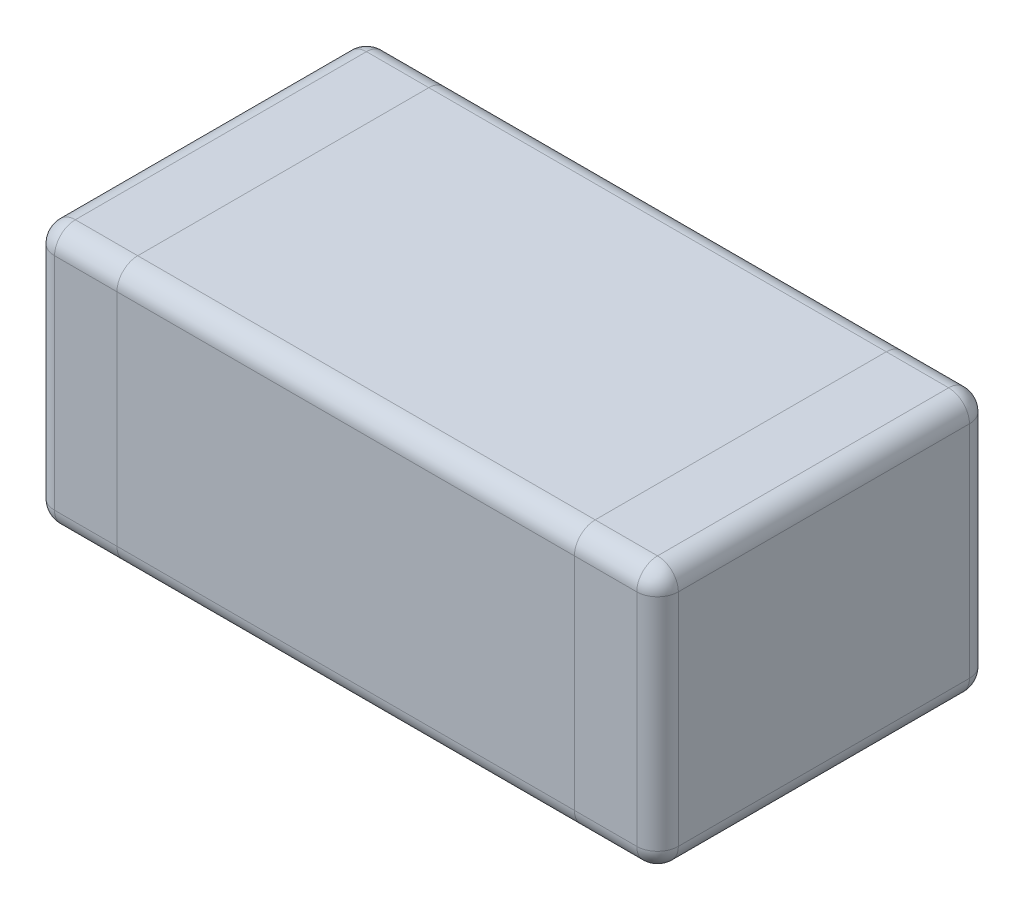
ISO-10303-21;
HEADER;
FILE_DESCRIPTION(('STEP AP214'),'2;1');
FILE_NAME('part.step','',(''),(''),'','','');
FILE_SCHEMA(('AUTOMOTIVE_DESIGN { 1 0 10303 214 1 1 1 1 }'));
ENDSEC;
DATA;
#1=APPLICATION_CONTEXT('core data for automotive mechanical design processes');
#2=APPLICATION_PROTOCOL_DEFINITION('international standard','automotive_design',2000,#1);
#3=PRODUCT_CONTEXT('',#1,'mechanical');
#4=PRODUCT('Part','Part','',(#3));
#5=PRODUCT_RELATED_PRODUCT_CATEGORY('part','',(#4));
#6=PRODUCT_DEFINITION_FORMATION('','',#4);
#7=PRODUCT_DEFINITION_CONTEXT('part definition',#1,'design');
#8=PRODUCT_DEFINITION('design','',#6,#7);
#9=PRODUCT_DEFINITION_SHAPE('','',#8);
#10=(LENGTH_UNIT() NAMED_UNIT(*) SI_UNIT(.MILLI.,.METRE.));
#11=(NAMED_UNIT(*) PLANE_ANGLE_UNIT() SI_UNIT($,.RADIAN.));
#12=(NAMED_UNIT(*) SI_UNIT($,.STERADIAN.) SOLID_ANGLE_UNIT());
#13=UNCERTAINTY_MEASURE_WITH_UNIT(LENGTH_MEASURE(1.E-05),#10,'distance_accuracy_value','');
#14=(GEOMETRIC_REPRESENTATION_CONTEXT(3) GLOBAL_UNCERTAINTY_ASSIGNED_CONTEXT((#13)) GLOBAL_UNIT_ASSIGNED_CONTEXT((#10,
#11,#12)) REPRESENTATION_CONTEXT('',''));
#15=CARTESIAN_POINT('',(0.,0.,0.));
#16=DIRECTION('',(0.,0.,1.));
#17=DIRECTION('',(1.,0.,0.));
#18=AXIS2_PLACEMENT_3D('',#15,#16,#17);
#19=CARTESIAN_POINT('',(0.7,0.63,-0.35));
#20=DIRECTION('',(0.,-1.,0.));
#21=DIRECTION('',(0.,0.,-1.));
#22=AXIS2_PLACEMENT_3D('',#19,#20,#21);
#23=CYLINDRICAL_SURFACE('',#22,0.05);
#24=CARTESIAN_POINT('',(0.7,0.58,-0.35));
#25=DIRECTION('',(0.,-1.,0.));
#26=DIRECTION('',(0.,0.,1.));
#27=AXIS2_PLACEMENT_3D('',#24,#25,#26);
#28=CIRCLE('',#27,0.05);
#29=CARTESIAN_POINT('',(0.7,0.58,-0.4));
#30=VERTEX_POINT('',#29);
#31=CARTESIAN_POINT('',(0.75,0.58,-0.35));
#32=VERTEX_POINT('',#31);
#33=EDGE_CURVE('E27',#30,#32,#28,.T.);
#34=ORIENTED_EDGE('',*,*,#33,.T.);
#35=DIRECTION('',(0.,1.,0.));
#36=VECTOR('',#35,1.);
#37=CARTESIAN_POINT('',(0.75,0.63,-0.35));
#38=LINE('',#37,#36);
#39=CARTESIAN_POINT('',(0.75,0.05,-0.35));
#40=VERTEX_POINT('',#39);
#41=EDGE_CURVE('E314',#40,#32,#38,.T.);
#42=ORIENTED_EDGE('',*,*,#41,.F.);
#43=CARTESIAN_POINT('',(0.7,0.05,-0.35));
#44=DIRECTION('',(0.,1.,0.));
#45=DIRECTION('',(0.,0.,-1.));
#46=AXIS2_PLACEMENT_3D('',#43,#44,#45);
#47=CIRCLE('',#46,0.05);
#48=CARTESIAN_POINT('',(0.7,0.05,-0.4));
#49=VERTEX_POINT('',#48);
#50=EDGE_CURVE('E11',#40,#49,#47,.T.);
#51=ORIENTED_EDGE('',*,*,#50,.T.);
#52=DIRECTION('',(0.,-1.,0.));
#53=VECTOR('',#52,1.);
#54=CARTESIAN_POINT('',(0.7,0.63,-0.4));
#55=LINE('',#54,#53);
#56=EDGE_CURVE('E230',#30,#49,#55,.T.);
#57=ORIENTED_EDGE('',*,*,#56,.F.);
#58=EDGE_LOOP('',(#34,#42,#51,#57));
#59=FACE_BOUND('',#58,.T.);
#60=ADVANCED_FACE('F16',(#59),#23,.T.);
#61=CARTESIAN_POINT('',(0.7,0.05,-0.35));
#62=DIRECTION('',(0.,1.,0.));
#63=DIRECTION('',(1.,0.,0.));
#64=AXIS2_PLACEMENT_3D('',#61,#62,#63);
#65=SPHERICAL_SURFACE('',#64,0.05);
#66=CARTESIAN_POINT('',(0.7,0.05,-0.35));
#67=DIRECTION('',(0.,0.,-1.));
#68=DIRECTION('',(-1.,0.,0.));
#69=AXIS2_PLACEMENT_3D('',#66,#67,#68);
#70=CIRCLE('',#69,0.05);
#71=CARTESIAN_POINT('',(0.7,0.,-0.35));
#72=VERTEX_POINT('',#71);
#73=EDGE_CURVE('E391',#40,#72,#70,.T.);
#74=ORIENTED_EDGE('',*,*,#73,.T.);
#75=CARTESIAN_POINT('',(0.7,0.05,-0.35));
#76=DIRECTION('',(1.,0.,0.));
#77=DIRECTION('',(0.,0.,-1.));
#78=AXIS2_PLACEMENT_3D('',#75,#76,#77);
#79=CIRCLE('',#78,0.05);
#80=EDGE_CURVE('E353',#72,#49,#79,.T.);
#81=ORIENTED_EDGE('',*,*,#80,.T.);
#82=ORIENTED_EDGE('',*,*,#50,.F.);
#83=EDGE_LOOP('',(#74,#81,#82));
#84=FACE_BOUND('',#83,.T.);
#85=ADVANCED_FACE('F553',(#84),#65,.T.);
#86=CARTESIAN_POINT('',(0.7,0.58,-0.35));
#87=DIRECTION('',(0.,1.,0.));
#88=DIRECTION('',(1.,0.,0.));
#89=AXIS2_PLACEMENT_3D('',#86,#87,#88);
#90=SPHERICAL_SURFACE('',#89,0.05);
#91=CARTESIAN_POINT('',(0.7,0.58,-0.35));
#92=DIRECTION('',(1.,0.,0.));
#93=DIRECTION('',(0.,1.,0.));
#94=AXIS2_PLACEMENT_3D('',#91,#92,#93);
#95=CIRCLE('',#94,0.05);
#96=CARTESIAN_POINT('',(0.7,0.63,-0.35));
#97=VERTEX_POINT('',#96);
#98=EDGE_CURVE('E239',#30,#97,#95,.T.);
#99=ORIENTED_EDGE('',*,*,#98,.T.);
#100=CARTESIAN_POINT('',(0.7,0.58,-0.35));
#101=DIRECTION('',(0.,0.,-1.));
#102=DIRECTION('',(-1.,0.,0.));
#103=AXIS2_PLACEMENT_3D('',#100,#101,#102);
#104=CIRCLE('',#103,0.05);
#105=EDGE_CURVE('E465',#97,#32,#104,.T.);
#106=ORIENTED_EDGE('',*,*,#105,.T.);
#107=ORIENTED_EDGE('',*,*,#33,.F.);
#108=EDGE_LOOP('',(#99,#106,#107));
#109=FACE_BOUND('',#108,.T.);
#110=ADVANCED_FACE('F559',(#109),#90,.T.);
#111=CARTESIAN_POINT('',(0.7,0.05,0.4));
#112=DIRECTION('',(0.,0.,1.));
#113=DIRECTION('',(1.,0.,0.));
#114=AXIS2_PLACEMENT_3D('',#111,#112,#113);
#115=CYLINDRICAL_SURFACE('',#114,0.05);
#116=CARTESIAN_POINT('',(0.7,0.05,0.35));
#117=DIRECTION('',(0.,0.,-1.));
#118=DIRECTION('',(1.,0.,0.));
#119=AXIS2_PLACEMENT_3D('',#116,#117,#118);
#120=CIRCLE('',#119,0.05);
#121=CARTESIAN_POINT('',(0.75,0.05,0.35));
#122=VERTEX_POINT('',#121);
#123=CARTESIAN_POINT('',(0.7,0.,0.35));
#124=VERTEX_POINT('',#123);
#125=EDGE_CURVE('E311',#122,#124,#120,.T.);
#126=ORIENTED_EDGE('',*,*,#125,.T.);
#127=DIRECTION('',(0.,0.,1.));
#128=VECTOR('',#127,1.);
#129=CARTESIAN_POINT('',(0.7,0.,0.4));
#130=LINE('',#129,#128);
#131=EDGE_CURVE('E275',#72,#124,#130,.T.);
#132=ORIENTED_EDGE('',*,*,#131,.F.);
#133=ORIENTED_EDGE('',*,*,#73,.F.);
#134=DIRECTION('',(0.,0.,-1.));
#135=VECTOR('',#134,1.);
#136=CARTESIAN_POINT('',(0.75,0.05,-0.4));
#137=LINE('',#136,#135);
#138=EDGE_CURVE('E307',#122,#40,#137,.T.);
#139=ORIENTED_EDGE('',*,*,#138,.F.);
#140=EDGE_LOOP('',(#126,#132,#133,#139));
#141=FACE_BOUND('',#140,.T.);
#142=ADVANCED_FACE('F695',(#141),#115,.T.);
#143=CARTESIAN_POINT('',(-0.75,0.05,-0.35));
#144=DIRECTION('',(1.,0.,0.));
#145=DIRECTION('',(0.,0.,-1.));
#146=AXIS2_PLACEMENT_3D('',#143,#144,#145);
#147=CYLINDRICAL_SURFACE('',#146,0.05);
#148=CARTESIAN_POINT('',(-0.55,0.05,-0.35));
#149=DIRECTION('',(-1.,0.,0.));
#150=DIRECTION('',(0.,0.,-1.));
#151=AXIS2_PLACEMENT_3D('',#148,#149,#150);
#152=CIRCLE('',#151,0.05);
#153=CARTESIAN_POINT('',(-0.55,0.05,-0.4));
#154=VERTEX_POINT('',#153);
#155=CARTESIAN_POINT('',(-0.55,0.,-0.35));
#156=VERTEX_POINT('',#155);
#157=EDGE_CURVE('E265',#154,#156,#152,.T.);
#158=ORIENTED_EDGE('',*,*,#157,.F.);
#159=DIRECTION('',(-1.,0.,0.));
#160=VECTOR('',#159,1.);
#161=CARTESIAN_POINT('',(-0.75,0.05,-0.4));
#162=LINE('',#161,#160);
#163=CARTESIAN_POINT('',(0.55,0.05,-0.4));
#164=VERTEX_POINT('',#163);
#165=EDGE_CURVE('E218',#164,#154,#162,.T.);
#166=ORIENTED_EDGE('',*,*,#165,.F.);
#167=CARTESIAN_POINT('',(0.55,0.05,-0.35));
#168=DIRECTION('',(1.,0.,0.));
#169=DIRECTION('',(0.,0.,1.));
#170=AXIS2_PLACEMENT_3D('',#167,#168,#169);
#171=CIRCLE('',#170,0.05);
#172=CARTESIAN_POINT('',(0.55,0.,-0.35));
#173=VERTEX_POINT('',#172);
#174=EDGE_CURVE('E354',#173,#164,#171,.T.);
#175=ORIENTED_EDGE('',*,*,#174,.F.);
#176=DIRECTION('',(1.,0.,0.));
#177=VECTOR('',#176,1.);
#178=CARTESIAN_POINT('',(0.75,0.,-0.35));
#179=LINE('',#178,#177);
#180=EDGE_CURVE('E388',#156,#173,#179,.T.);
#181=ORIENTED_EDGE('',*,*,#180,.F.);
#182=EDGE_LOOP('',(#158,#166,#175,#181));
#183=FACE_BOUND('',#182,.T.);
#184=ADVANCED_FACE('F532',(#183),#147,.T.);
#185=CARTESIAN_POINT('',(0.75,0.58,-0.35));
#186=DIRECTION('',(-1.,0.,0.));
#187=DIRECTION('',(0.,0.,1.));
#188=AXIS2_PLACEMENT_3D('',#185,#186,#187);
#189=CYLINDRICAL_SURFACE('',#188,0.05);
#190=CARTESIAN_POINT('',(-0.55,0.58,-0.35));
#191=DIRECTION('',(-1.,0.,0.));
#192=DIRECTION('',(0.,0.,-1.));
#193=AXIS2_PLACEMENT_3D('',#190,#191,#192);
#194=CIRCLE('',#193,0.05);
#195=CARTESIAN_POINT('',(-0.55,0.63,-0.35));
#196=VERTEX_POINT('',#195);
#197=CARTESIAN_POINT('',(-0.55,0.58,-0.4));
#198=VERTEX_POINT('',#197);
#199=EDGE_CURVE('E271',#196,#198,#194,.T.);
#200=ORIENTED_EDGE('',*,*,#199,.F.);
#201=DIRECTION('',(-1.,0.,0.));
#202=VECTOR('',#201,1.);
#203=CARTESIAN_POINT('',(0.75,0.63,-0.35));
#204=LINE('',#203,#202);
#205=CARTESIAN_POINT('',(0.55,0.63,-0.35));
#206=VERTEX_POINT('',#205);
#207=EDGE_CURVE('E97',#206,#196,#204,.T.);
#208=ORIENTED_EDGE('',*,*,#207,.F.);
#209=CARTESIAN_POINT('',(0.55,0.58,-0.35));
#210=DIRECTION('',(1.,0.,0.));
#211=DIRECTION('',(0.,0.,1.));
#212=AXIS2_PLACEMENT_3D('',#209,#210,#211);
#213=CIRCLE('',#212,0.05);
#214=CARTESIAN_POINT('',(0.55,0.58,-0.4));
#215=VERTEX_POINT('',#214);
#216=EDGE_CURVE('E233',#215,#206,#213,.T.);
#217=ORIENTED_EDGE('',*,*,#216,.F.);
#218=DIRECTION('',(1.,0.,0.));
#219=VECTOR('',#218,1.);
#220=CARTESIAN_POINT('',(-0.75,0.58,-0.4));
#221=LINE('',#220,#219);
#222=EDGE_CURVE('E208',#198,#215,#221,.T.);
#223=ORIENTED_EDGE('',*,*,#222,.F.);
#224=EDGE_LOOP('',(#200,#208,#217,#223));
#225=FACE_BOUND('',#224,.T.);
#226=ADVANCED_FACE('F234',(#225),#189,.T.);
#227=CARTESIAN_POINT('',(0.7,0.58,-0.4));
#228=DIRECTION('',(0.,0.,-1.));
#229=DIRECTION('',(-1.,0.,0.));
#230=AXIS2_PLACEMENT_3D('',#227,#228,#229);
#231=CYLINDRICAL_SURFACE('',#230,0.05);
#232=CARTESIAN_POINT('',(0.7,0.58,0.35));
#233=DIRECTION('',(0.,0.,-1.));
#234=DIRECTION('',(1.,0.,0.));
#235=AXIS2_PLACEMENT_3D('',#232,#233,#234);
#236=CIRCLE('',#235,0.05);
#237=CARTESIAN_POINT('',(0.7,0.63,0.35));
#238=VERTEX_POINT('',#237);
#239=CARTESIAN_POINT('',(0.75,0.58,0.35));
#240=VERTEX_POINT('',#239);
#241=EDGE_CURVE('E308',#238,#240,#236,.T.);
#242=ORIENTED_EDGE('',*,*,#241,.T.);
#243=DIRECTION('',(0.,0.,1.));
#244=VECTOR('',#243,1.);
#245=CARTESIAN_POINT('',(0.75,0.58,0.4));
#246=LINE('',#245,#244);
#247=EDGE_CURVE('E369',#32,#240,#246,.T.);
#248=ORIENTED_EDGE('',*,*,#247,.F.);
#249=ORIENTED_EDGE('',*,*,#105,.F.);
#250=DIRECTION('',(0.,0.,-1.));
#251=VECTOR('',#250,1.);
#252=CARTESIAN_POINT('',(0.7,0.63,-0.4));
#253=LINE('',#252,#251);
#254=EDGE_CURVE('E325',#238,#97,#253,.T.);
#255=ORIENTED_EDGE('',*,*,#254,.F.);
#256=EDGE_LOOP('',(#242,#248,#249,#255));
#257=FACE_BOUND('',#256,.T.);
#258=ADVANCED_FACE('F563',(#257),#231,.T.);
#259=CARTESIAN_POINT('',(0.7,0.05,0.35));
#260=DIRECTION('',(0.,1.,0.));
#261=DIRECTION('',(1.,0.,0.));
#262=AXIS2_PLACEMENT_3D('',#259,#260,#261);
#263=SPHERICAL_SURFACE('',#262,0.05);
#264=CARTESIAN_POINT('',(0.7,0.05,0.35));
#265=DIRECTION('',(0.,-1.,0.));
#266=DIRECTION('',(0.,0.,-1.));
#267=AXIS2_PLACEMENT_3D('',#264,#265,#266);
#268=CIRCLE('',#267,0.05);
#269=CARTESIAN_POINT('',(0.7,0.05,0.4));
#270=VERTEX_POINT('',#269);
#271=EDGE_CURVE('E280',#122,#270,#268,.T.);
#272=ORIENTED_EDGE('',*,*,#271,.T.);
#273=CARTESIAN_POINT('',(0.7,0.05,0.35));
#274=DIRECTION('',(1.,0.,0.));
#275=DIRECTION('',(0.,0.,-1.));
#276=AXIS2_PLACEMENT_3D('',#273,#274,#275);
#277=CIRCLE('',#276,0.05);
#278=EDGE_CURVE('E315',#270,#124,#277,.T.);
#279=ORIENTED_EDGE('',*,*,#278,.T.);
#280=ORIENTED_EDGE('',*,*,#125,.F.);
#281=EDGE_LOOP('',(#272,#279,#280));
#282=FACE_BOUND('',#281,.T.);
#283=ADVANCED_FACE('F510',(#282),#263,.T.);
#284=CARTESIAN_POINT('',(-0.7,0.05,-0.35));
#285=DIRECTION('',(0.,1.,0.));
#286=DIRECTION('',(1.,0.,0.));
#287=AXIS2_PLACEMENT_3D('',#284,#285,#286);
#288=SPHERICAL_SURFACE('',#287,0.05);
#289=CARTESIAN_POINT('',(-0.7,0.05,-0.35));
#290=DIRECTION('',(0.,0.,-1.));
#291=DIRECTION('',(-1.,0.,0.));
#292=AXIS2_PLACEMENT_3D('',#289,#290,#291);
#293=CIRCLE('',#292,0.05);
#294=CARTESIAN_POINT('',(-0.7,0.,-0.35));
#295=VERTEX_POINT('',#294);
#296=CARTESIAN_POINT('',(-0.75,0.05,-0.35));
#297=VERTEX_POINT('',#296);
#298=EDGE_CURVE('E20',#295,#297,#293,.T.);
#299=ORIENTED_EDGE('',*,*,#298,.T.);
#300=CARTESIAN_POINT('',(-0.7,0.05,-0.35));
#301=DIRECTION('',(0.,-1.,0.));
#302=DIRECTION('',(0.,0.,-1.));
#303=AXIS2_PLACEMENT_3D('',#300,#301,#302);
#304=CIRCLE('',#303,0.05);
#305=CARTESIAN_POINT('',(-0.7,0.05,-0.4));
#306=VERTEX_POINT('',#305);
#307=EDGE_CURVE('E416',#297,#306,#304,.T.);
#308=ORIENTED_EDGE('',*,*,#307,.T.);
#309=CARTESIAN_POINT('',(-0.7,0.05,-0.35));
#310=DIRECTION('',(1.,0.,0.));
#311=DIRECTION('',(0.,0.,1.));
#312=AXIS2_PLACEMENT_3D('',#309,#310,#311);
#313=CIRCLE('',#312,0.05);
#314=EDGE_CURVE('E268',#295,#306,#313,.T.);
#315=ORIENTED_EDGE('',*,*,#314,.F.);
#316=EDGE_LOOP('',(#299,#308,#315));
#317=FACE_BOUND('',#316,.T.);
#318=ADVANCED_FACE('F613',(#317),#288,.T.);
#319=CARTESIAN_POINT('',(-0.7,0.58,-0.35));
#320=DIRECTION('',(0.,1.,0.));
#321=DIRECTION('',(1.,0.,0.));
#322=AXIS2_PLACEMENT_3D('',#319,#320,#321);
#323=SPHERICAL_SURFACE('',#322,0.05);
#324=CARTESIAN_POINT('',(-0.7,0.58,-0.35));
#325=DIRECTION('',(0.,1.,0.));
#326=DIRECTION('',(0.,0.,1.));
#327=AXIS2_PLACEMENT_3D('',#324,#325,#326);
#328=CIRCLE('',#327,0.05);
#329=CARTESIAN_POINT('',(-0.7,0.58,-0.4));
#330=VERTEX_POINT('',#329);
#331=CARTESIAN_POINT('',(-0.75,0.58,-0.35));
#332=VERTEX_POINT('',#331);
#333=EDGE_CURVE('E419',#330,#332,#328,.T.);
#334=ORIENTED_EDGE('',*,*,#333,.T.);
#335=CARTESIAN_POINT('',(-0.7,0.58,-0.35));
#336=DIRECTION('',(0.,0.,-1.));
#337=DIRECTION('',(-1.,0.,0.));
#338=AXIS2_PLACEMENT_3D('',#335,#336,#337);
#339=CIRCLE('',#338,0.05);
#340=CARTESIAN_POINT('',(-0.7,0.63,-0.35));
#341=VERTEX_POINT('',#340);
#342=EDGE_CURVE('E364',#332,#341,#339,.T.);
#343=ORIENTED_EDGE('',*,*,#342,.T.);
#344=CARTESIAN_POINT('',(-0.7,0.58,-0.35));
#345=DIRECTION('',(1.,0.,0.));
#346=DIRECTION('',(0.,0.,1.));
#347=AXIS2_PLACEMENT_3D('',#344,#345,#346);
#348=CIRCLE('',#347,0.05);
#349=EDGE_CURVE('E245',#330,#341,#348,.T.);
#350=ORIENTED_EDGE('',*,*,#349,.F.);
#351=EDGE_LOOP('',(#334,#343,#350));
#352=FACE_BOUND('',#351,.T.);
#353=ADVANCED_FACE('F605',(#352),#323,.T.);
#354=CARTESIAN_POINT('',(0.7,0.58,0.35));
#355=DIRECTION('',(0.,1.,0.));
#356=DIRECTION('',(1.,0.,0.));
#357=AXIS2_PLACEMENT_3D('',#354,#355,#356);
#358=SPHERICAL_SURFACE('',#357,0.05);
#359=CARTESIAN_POINT('',(0.7,0.58,0.35));
#360=DIRECTION('',(1.,0.,0.));
#361=DIRECTION('',(0.,0.,-1.));
#362=AXIS2_PLACEMENT_3D('',#359,#360,#361);
#363=CIRCLE('',#362,0.05);
#364=CARTESIAN_POINT('',(0.7,0.58,0.4));
#365=VERTEX_POINT('',#364);
#366=EDGE_CURVE('E350',#238,#365,#363,.T.);
#367=ORIENTED_EDGE('',*,*,#366,.T.);
#368=CARTESIAN_POINT('',(0.7,0.58,0.35));
#369=DIRECTION('',(0.,1.,0.));
#370=DIRECTION('',(0.,0.,1.));
#371=AXIS2_PLACEMENT_3D('',#368,#369,#370);
#372=CIRCLE('',#371,0.05);
#373=EDGE_CURVE('E276',#365,#240,#372,.T.);
#374=ORIENTED_EDGE('',*,*,#373,.T.);
#375=ORIENTED_EDGE('',*,*,#241,.F.);
#376=EDGE_LOOP('',(#367,#374,#375));
#377=FACE_BOUND('',#376,.T.);
#378=ADVANCED_FACE('F672',(#377),#358,.T.);
#379=CARTESIAN_POINT('',(0.7,0.63,0.35));
#380=DIRECTION('',(0.,-1.,0.));
#381=DIRECTION('',(0.,0.,-1.));
#382=AXIS2_PLACEMENT_3D('',#379,#380,#381);
#383=CYLINDRICAL_SURFACE('',#382,0.05);
#384=ORIENTED_EDGE('',*,*,#373,.F.);
#385=DIRECTION('',(0.,1.,0.));
#386=VECTOR('',#385,1.);
#387=CARTESIAN_POINT('',(0.7,0.63,0.4));
#388=LINE('',#387,#386);
#389=EDGE_CURVE('E287',#270,#365,#388,.T.);
#390=ORIENTED_EDGE('',*,*,#389,.F.);
#391=ORIENTED_EDGE('',*,*,#271,.F.);
#392=DIRECTION('',(0.,-1.,0.));
#393=VECTOR('',#392,1.);
#394=CARTESIAN_POINT('',(0.75,0.63,0.35));
#395=LINE('',#394,#393);
#396=EDGE_CURVE('E332',#240,#122,#395,.T.);
#397=ORIENTED_EDGE('',*,*,#396,.F.);
#398=EDGE_LOOP('',(#384,#390,#391,#397));
#399=FACE_BOUND('',#398,.T.);
#400=ADVANCED_FACE('F671',(#399),#383,.T.);
#401=CARTESIAN_POINT('',(-0.75,0.05,0.35));
#402=DIRECTION('',(-1.,0.,0.));
#403=DIRECTION('',(0.,0.,1.));
#404=AXIS2_PLACEMENT_3D('',#401,#402,#403);
#405=CYLINDRICAL_SURFACE('',#404,0.05);
#406=CARTESIAN_POINT('',(-0.55,0.05,0.35));
#407=DIRECTION('',(-1.,0.,0.));
#408=DIRECTION('',(0.,0.,-1.));
#409=AXIS2_PLACEMENT_3D('',#406,#407,#408);
#410=CIRCLE('',#409,0.05);
#411=CARTESIAN_POINT('',(-0.55,0.,0.35));
#412=VERTEX_POINT('',#411);
#413=CARTESIAN_POINT('',(-0.55,0.05,0.4));
#414=VERTEX_POINT('',#413);
#415=EDGE_CURVE('E454',#412,#414,#410,.T.);
#416=ORIENTED_EDGE('',*,*,#415,.F.);
#417=DIRECTION('',(-1.,0.,0.));
#418=VECTOR('',#417,1.);
#419=CARTESIAN_POINT('',(-0.75,0.,0.35));
#420=LINE('',#419,#418);
#421=CARTESIAN_POINT('',(0.55,0.,0.35));
#422=VERTEX_POINT('',#421);
#423=EDGE_CURVE('E261',#422,#412,#420,.T.);
#424=ORIENTED_EDGE('',*,*,#423,.F.);
#425=CARTESIAN_POINT('',(0.55,0.05,0.35));
#426=DIRECTION('',(1.,0.,0.));
#427=DIRECTION('',(0.,0.,1.));
#428=AXIS2_PLACEMENT_3D('',#425,#426,#427);
#429=CIRCLE('',#428,0.05);
#430=CARTESIAN_POINT('',(0.55,0.05,0.4));
#431=VERTEX_POINT('',#430);
#432=EDGE_CURVE('E381',#431,#422,#429,.T.);
#433=ORIENTED_EDGE('',*,*,#432,.F.);
#434=DIRECTION('',(1.,0.,0.));
#435=VECTOR('',#434,1.);
#436=CARTESIAN_POINT('',(0.75,0.05,0.4));
#437=LINE('',#436,#435);
#438=EDGE_CURVE('E264',#414,#431,#437,.T.);
#439=ORIENTED_EDGE('',*,*,#438,.F.);
#440=EDGE_LOOP('',(#416,#424,#433,#439));
#441=FACE_BOUND('',#440,.T.);
#442=ADVANCED_FACE('F520',(#441),#405,.T.);
#443=CARTESIAN_POINT('',(-0.7,0.05,0.4));
#444=DIRECTION('',(0.,0.,-1.));
#445=DIRECTION('',(-1.,0.,0.));
#446=AXIS2_PLACEMENT_3D('',#443,#444,#445);
#447=CYLINDRICAL_SURFACE('',#446,0.05);
#448=CARTESIAN_POINT('',(-0.7,0.05,0.35));
#449=DIRECTION('',(0.,0.,-1.));
#450=DIRECTION('',(1.,0.,0.));
#451=AXIS2_PLACEMENT_3D('',#448,#449,#450);
#452=CIRCLE('',#451,0.05);
#453=CARTESIAN_POINT('',(-0.7,0.,0.35));
#454=VERTEX_POINT('',#453);
#455=CARTESIAN_POINT('',(-0.75,0.05,0.35));
#456=VERTEX_POINT('',#455);
#457=EDGE_CURVE('E360',#454,#456,#452,.T.);
#458=ORIENTED_EDGE('',*,*,#457,.T.);
#459=DIRECTION('',(0.,0.,1.));
#460=VECTOR('',#459,1.);
#461=CARTESIAN_POINT('',(-0.75,0.05,0.4));
#462=LINE('',#461,#460);
#463=EDGE_CURVE('E297',#297,#456,#462,.T.);
#464=ORIENTED_EDGE('',*,*,#463,.F.);
#465=ORIENTED_EDGE('',*,*,#298,.F.);
#466=DIRECTION('',(0.,0.,-1.));
#467=VECTOR('',#466,1.);
#468=CARTESIAN_POINT('',(-0.7,0.,-0.4));
#469=LINE('',#468,#467);
#470=EDGE_CURVE('E346',#454,#295,#469,.T.);
#471=ORIENTED_EDGE('',*,*,#470,.F.);
#472=EDGE_LOOP('',(#458,#464,#465,#471));
#473=FACE_BOUND('',#472,.T.);
#474=ADVANCED_FACE('F581',(#473),#447,.T.);
#475=CARTESIAN_POINT('',(-0.7,0.63,-0.35));
#476=DIRECTION('',(0.,-1.,0.));
#477=DIRECTION('',(0.,0.,-1.));
#478=AXIS2_PLACEMENT_3D('',#475,#476,#477);
#479=CYLINDRICAL_SURFACE('',#478,0.05);
#480=ORIENTED_EDGE('',*,*,#307,.F.);
#481=DIRECTION('',(0.,-1.,0.));
#482=VECTOR('',#481,1.);
#483=CARTESIAN_POINT('',(-0.75,0.63,-0.35));
#484=LINE('',#483,#482);
#485=EDGE_CURVE('E293',#332,#297,#484,.T.);
#486=ORIENTED_EDGE('',*,*,#485,.F.);
#487=ORIENTED_EDGE('',*,*,#333,.F.);
#488=DIRECTION('',(0.,1.,0.));
#489=VECTOR('',#488,1.);
#490=CARTESIAN_POINT('',(-0.7,0.63,-0.4));
#491=LINE('',#490,#489);
#492=EDGE_CURVE('E231',#306,#330,#491,.T.);
#493=ORIENTED_EDGE('',*,*,#492,.F.);
#494=EDGE_LOOP('',(#480,#486,#487,#493));
#495=FACE_BOUND('',#494,.T.);
#496=ADVANCED_FACE('F579',(#495),#479,.T.);
#497=CARTESIAN_POINT('',(-0.7,0.58,-0.4));
#498=DIRECTION('',(0.,0.,1.));
#499=DIRECTION('',(1.,0.,0.));
#500=AXIS2_PLACEMENT_3D('',#497,#498,#499);
#501=CYLINDRICAL_SURFACE('',#500,0.05);
#502=CARTESIAN_POINT('',(-0.7,0.58,0.35));
#503=DIRECTION('',(0.,0.,-1.));
#504=DIRECTION('',(1.,0.,0.));
#505=AXIS2_PLACEMENT_3D('',#502,#503,#504);
#506=CIRCLE('',#505,0.05);
#507=CARTESIAN_POINT('',(-0.75,0.58,0.35));
#508=VERTEX_POINT('',#507);
#509=CARTESIAN_POINT('',(-0.7,0.63,0.35));
#510=VERTEX_POINT('',#509);
#511=EDGE_CURVE('E365',#508,#510,#506,.T.);
#512=ORIENTED_EDGE('',*,*,#511,.T.);
#513=DIRECTION('',(0.,0.,1.));
#514=VECTOR('',#513,1.);
#515=CARTESIAN_POINT('',(-0.7,0.63,-0.4));
#516=LINE('',#515,#514);
#517=EDGE_CURVE('E286',#341,#510,#516,.T.);
#518=ORIENTED_EDGE('',*,*,#517,.F.);
#519=ORIENTED_EDGE('',*,*,#342,.F.);
#520=DIRECTION('',(0.,0.,-1.));
#521=VECTOR('',#520,1.);
#522=CARTESIAN_POINT('',(-0.75,0.58,0.4));
#523=LINE('',#522,#521);
#524=EDGE_CURVE('E298',#508,#332,#523,.T.);
#525=ORIENTED_EDGE('',*,*,#524,.F.);
#526=EDGE_LOOP('',(#512,#518,#519,#525));
#527=FACE_BOUND('',#526,.T.);
#528=ADVANCED_FACE('F569',(#527),#501,.T.);
#529=CARTESIAN_POINT('',(0.75,0.58,0.35));
#530=DIRECTION('',(1.,0.,0.));
#531=DIRECTION('',(0.,0.,-1.));
#532=AXIS2_PLACEMENT_3D('',#529,#530,#531);
#533=CYLINDRICAL_SURFACE('',#532,0.05);
#534=CARTESIAN_POINT('',(-0.55,0.58,0.35));
#535=DIRECTION('',(-1.,0.,0.));
#536=DIRECTION('',(0.,0.,-1.));
#537=AXIS2_PLACEMENT_3D('',#534,#535,#536);
#538=CIRCLE('',#537,0.05);
#539=CARTESIAN_POINT('',(-0.55,0.58,0.4));
#540=VERTEX_POINT('',#539);
#541=CARTESIAN_POINT('',(-0.55,0.63,0.35));
#542=VERTEX_POINT('',#541);
#543=EDGE_CURVE('E337',#540,#542,#538,.T.);
#544=ORIENTED_EDGE('',*,*,#543,.F.);
#545=DIRECTION('',(-1.,0.,0.));
#546=VECTOR('',#545,1.);
#547=CARTESIAN_POINT('',(-0.75,0.58,0.4));
#548=LINE('',#547,#546);
#549=CARTESIAN_POINT('',(0.55,0.58,0.4));
#550=VERTEX_POINT('',#549);
#551=EDGE_CURVE('E256',#550,#540,#548,.T.);
#552=ORIENTED_EDGE('',*,*,#551,.F.);
#553=CARTESIAN_POINT('',(0.55,0.58,0.35));
#554=DIRECTION('',(1.,0.,0.));
#555=DIRECTION('',(0.,0.,1.));
#556=AXIS2_PLACEMENT_3D('',#553,#554,#555);
#557=CIRCLE('',#556,0.05);
#558=CARTESIAN_POINT('',(0.55,0.63,0.35));
#559=VERTEX_POINT('',#558);
#560=EDGE_CURVE('E399',#559,#550,#557,.T.);
#561=ORIENTED_EDGE('',*,*,#560,.F.);
#562=DIRECTION('',(1.,0.,0.));
#563=VECTOR('',#562,1.);
#564=CARTESIAN_POINT('',(0.75,0.63,0.35));
#565=LINE('',#564,#563);
#566=EDGE_CURVE('E109',#542,#559,#565,.T.);
#567=ORIENTED_EDGE('',*,*,#566,.F.);
#568=EDGE_LOOP('',(#544,#552,#561,#567));
#569=FACE_BOUND('',#568,.T.);
#570=ADVANCED_FACE('F565',(#569),#533,.T.);
#571=CARTESIAN_POINT('',(-0.7,0.05,0.35));
#572=DIRECTION('',(0.,1.,0.));
#573=DIRECTION('',(1.,0.,0.));
#574=AXIS2_PLACEMENT_3D('',#571,#572,#573);
#575=SPHERICAL_SURFACE('',#574,0.05);
#576=CARTESIAN_POINT('',(-0.7,0.05,0.35));
#577=DIRECTION('',(1.,0.,0.));
#578=DIRECTION('',(0.,0.,1.));
#579=AXIS2_PLACEMENT_3D('',#576,#577,#578);
#580=CIRCLE('',#579,0.05);
#581=CARTESIAN_POINT('',(-0.7,0.05,0.4));
#582=VERTEX_POINT('',#581);
#583=EDGE_CURVE('E384',#582,#454,#580,.T.);
#584=ORIENTED_EDGE('',*,*,#583,.F.);
#585=CARTESIAN_POINT('',(-0.7,0.05,0.35));
#586=DIRECTION('',(0.,-1.,0.));
#587=DIRECTION('',(0.,0.,-1.));
#588=AXIS2_PLACEMENT_3D('',#585,#586,#587);
#589=CIRCLE('',#588,0.05);
#590=EDGE_CURVE('E260',#582,#456,#589,.T.);
#591=ORIENTED_EDGE('',*,*,#590,.T.);
#592=ORIENTED_EDGE('',*,*,#457,.F.);
#593=EDGE_LOOP('',(#584,#591,#592));
#594=FACE_BOUND('',#593,.T.);
#595=ADVANCED_FACE('F568',(#594),#575,.T.);
#596=CARTESIAN_POINT('',(-0.7,0.58,0.35));
#597=DIRECTION('',(0.,1.,0.));
#598=DIRECTION('',(1.,0.,0.));
#599=AXIS2_PLACEMENT_3D('',#596,#597,#598);
#600=SPHERICAL_SURFACE('',#599,0.05);
#601=ORIENTED_EDGE('',*,*,#511,.F.);
#602=CARTESIAN_POINT('',(-0.7,0.58,0.35));
#603=DIRECTION('',(0.,1.,0.));
#604=DIRECTION('',(0.,0.,1.));
#605=AXIS2_PLACEMENT_3D('',#602,#603,#604);
#606=CIRCLE('',#605,0.05);
#607=CARTESIAN_POINT('',(-0.7,0.58,0.4));
#608=VERTEX_POINT('',#607);
#609=EDGE_CURVE('E258',#508,#608,#606,.T.);
#610=ORIENTED_EDGE('',*,*,#609,.T.);
#611=CARTESIAN_POINT('',(-0.7,0.58,0.35));
#612=DIRECTION('',(1.,0.,0.));
#613=DIRECTION('',(0.,-1.,0.));
#614=AXIS2_PLACEMENT_3D('',#611,#612,#613);
#615=CIRCLE('',#614,0.05);
#616=EDGE_CURVE('E372',#510,#608,#615,.T.);
#617=ORIENTED_EDGE('',*,*,#616,.F.);
#618=EDGE_LOOP('',(#601,#610,#617));
#619=FACE_BOUND('',#618,.T.);
#620=ADVANCED_FACE('F573',(#619),#600,.T.);
#621=CARTESIAN_POINT('',(-0.7,0.63,0.35));
#622=DIRECTION('',(0.,-1.,0.));
#623=DIRECTION('',(0.,0.,-1.));
#624=AXIS2_PLACEMENT_3D('',#621,#622,#623);
#625=CYLINDRICAL_SURFACE('',#624,0.05);
#626=ORIENTED_EDGE('',*,*,#609,.F.);
#627=DIRECTION('',(0.,1.,0.));
#628=VECTOR('',#627,1.);
#629=CARTESIAN_POINT('',(-0.75,0.63,0.35));
#630=LINE('',#629,#628);
#631=EDGE_CURVE('E217',#456,#508,#630,.T.);
#632=ORIENTED_EDGE('',*,*,#631,.F.);
#633=ORIENTED_EDGE('',*,*,#590,.F.);
#634=DIRECTION('',(0.,-1.,0.));
#635=VECTOR('',#634,1.);
#636=CARTESIAN_POINT('',(-0.7,0.63,0.4));
#637=LINE('',#636,#635);
#638=EDGE_CURVE('E299',#608,#582,#637,.T.);
#639=ORIENTED_EDGE('',*,*,#638,.F.);
#640=EDGE_LOOP('',(#626,#632,#633,#639));
#641=FACE_BOUND('',#640,.T.);
#642=ADVANCED_FACE('F576',(#641),#625,.T.);
#643=CARTESIAN_POINT('',(0.75,0.,-0.4));
#644=DIRECTION('',(0.,-1.,0.));
#645=DIRECTION('',(0.,0.,-1.));
#646=AXIS2_PLACEMENT_3D('',#643,#644,#645);
#647=PLANE('',#646);
#648=DIRECTION('',(0.,0.,1.));
#649=VECTOR('',#648,1.);
#650=CARTESIAN_POINT('',(-0.55,0.,-0.4));
#651=LINE('',#650,#649);
#652=EDGE_CURVE('E342',#156,#412,#651,.T.);
#653=ORIENTED_EDGE('',*,*,#652,.F.);
#654=ORIENTED_EDGE('',*,*,#180,.T.);
#655=DIRECTION('',(0.,0.,-1.));
#656=VECTOR('',#655,1.);
#657=CARTESIAN_POINT('',(0.55,0.,-0.4));
#658=LINE('',#657,#656);
#659=EDGE_CURVE('E406',#422,#173,#658,.T.);
#660=ORIENTED_EDGE('',*,*,#659,.F.);
#661=ORIENTED_EDGE('',*,*,#423,.T.);
#662=EDGE_LOOP('',(#653,#654,#660,#661));
#663=FACE_BOUND('',#662,.T.);
#664=ADVANCED_FACE('F525',(#663),#647,.T.);
#665=CARTESIAN_POINT('',(0.75,0.63,-0.4));
#666=DIRECTION('',(0.,-1.,0.));
#667=DIRECTION('',(0.,0.,-1.));
#668=AXIS2_PLACEMENT_3D('',#665,#666,#667);
#669=PLANE('',#668);
#670=ORIENTED_EDGE('',*,*,#207,.T.);
#671=DIRECTION('',(0.,0.,1.));
#672=VECTOR('',#671,1.);
#673=CARTESIAN_POINT('',(-0.55,0.63,-0.4));
#674=LINE('',#673,#672);
#675=EDGE_CURVE('E392',#196,#542,#674,.T.);
#676=ORIENTED_EDGE('',*,*,#675,.T.);
#677=ORIENTED_EDGE('',*,*,#566,.T.);
#678=DIRECTION('',(0.,0.,-1.));
#679=VECTOR('',#678,1.);
#680=CARTESIAN_POINT('',(0.55,0.63,-0.4));
#681=LINE('',#680,#679);
#682=EDGE_CURVE('E285',#559,#206,#681,.T.);
#683=ORIENTED_EDGE('',*,*,#682,.T.);
#684=EDGE_LOOP('',(#670,#676,#677,#683));
#685=FACE_BOUND('',#684,.T.);
#686=ADVANCED_FACE('F666',(#685),#669,.F.);
#687=CARTESIAN_POINT('',(-0.75,0.63,0.4));
#688=DIRECTION('',(0.,0.,-1.));
#689=DIRECTION('',(0.,-1.,0.));
#690=AXIS2_PLACEMENT_3D('',#687,#688,#689);
#691=PLANE('',#690);
#692=ORIENTED_EDGE('',*,*,#551,.T.);
#693=DIRECTION('',(0.,-1.,0.));
#694=VECTOR('',#693,1.);
#695=CARTESIAN_POINT('',(-0.55,0.63,0.4));
#696=LINE('',#695,#694);
#697=EDGE_CURVE('E304',#540,#414,#696,.T.);
#698=ORIENTED_EDGE('',*,*,#697,.T.);
#699=ORIENTED_EDGE('',*,*,#438,.T.);
#700=DIRECTION('',(0.,1.,0.));
#701=VECTOR('',#700,1.);
#702=CARTESIAN_POINT('',(0.55,0.63,0.4));
#703=LINE('',#702,#701);
#704=EDGE_CURVE('E380',#431,#550,#703,.T.);
#705=ORIENTED_EDGE('',*,*,#704,.T.);
#706=EDGE_LOOP('',(#692,#698,#699,#705));
#707=FACE_BOUND('',#706,.T.);
#708=ADVANCED_FACE('F638',(#707),#691,.F.);
#709=CARTESIAN_POINT('',(-0.75,0.63,0.4));
#710=DIRECTION('',(1.,0.,0.));
#711=DIRECTION('',(0.,1.,0.));
#712=AXIS2_PLACEMENT_3D('',#709,#710,#711);
#713=PLANE('',#712);
#714=ORIENTED_EDGE('',*,*,#631,.T.);
#715=ORIENTED_EDGE('',*,*,#524,.T.);
#716=ORIENTED_EDGE('',*,*,#485,.T.);
#717=ORIENTED_EDGE('',*,*,#463,.T.);
#718=EDGE_LOOP('',(#714,#715,#716,#717));
#719=FACE_BOUND('',#718,.T.);
#720=ADVANCED_FACE('F598',(#719),#713,.F.);
#721=CARTESIAN_POINT('',(-0.75,0.63,-0.4));
#722=DIRECTION('',(0.,0.,1.));
#723=DIRECTION('',(1.,0.,0.));
#724=AXIS2_PLACEMENT_3D('',#721,#722,#723);
#725=PLANE('',#724);
#726=ORIENTED_EDGE('',*,*,#165,.T.);
#727=DIRECTION('',(0.,1.,0.));
#728=VECTOR('',#727,1.);
#729=CARTESIAN_POINT('',(-0.55,0.63,-0.4));
#730=LINE('',#729,#728);
#731=EDGE_CURVE('E214',#154,#198,#730,.T.);
#732=ORIENTED_EDGE('',*,*,#731,.T.);
#733=ORIENTED_EDGE('',*,*,#222,.T.);
#734=DIRECTION('',(0.,-1.,0.));
#735=VECTOR('',#734,1.);
#736=CARTESIAN_POINT('',(0.55,0.63,-0.4));
#737=LINE('',#736,#735);
#738=EDGE_CURVE('E211',#215,#164,#737,.T.);
#739=ORIENTED_EDGE('',*,*,#738,.T.);
#740=EDGE_LOOP('',(#726,#732,#733,#739));
#741=FACE_BOUND('',#740,.T.);
#742=ADVANCED_FACE('F210',(#741),#725,.F.);
#743=CARTESIAN_POINT('',(0.75,0.63,0.4));
#744=DIRECTION('',(-1.,0.,0.));
#745=DIRECTION('',(0.,0.,1.));
#746=AXIS2_PLACEMENT_3D('',#743,#744,#745);
#747=PLANE('',#746);
#748=ORIENTED_EDGE('',*,*,#41,.T.);
#749=ORIENTED_EDGE('',*,*,#247,.T.);
#750=ORIENTED_EDGE('',*,*,#396,.T.);
#751=ORIENTED_EDGE('',*,*,#138,.T.);
#752=EDGE_LOOP('',(#748,#749,#750,#751));
#753=FACE_BOUND('',#752,.T.);
#754=ADVANCED_FACE('F571',(#753),#747,.F.);
#755=CARTESIAN_POINT('',(-0.75,0.63,-0.4));
#756=DIRECTION('',(0.,0.,1.));
#757=DIRECTION('',(1.,0.,0.));
#758=AXIS2_PLACEMENT_3D('',#755,#756,#757);
#759=PLANE('',#758);
#760=ORIENTED_EDGE('',*,*,#738,.F.);
#761=DIRECTION('',(1.,0.,0.));
#762=VECTOR('',#761,1.);
#763=CARTESIAN_POINT('',(-0.75,0.58,-0.4));
#764=LINE('',#763,#762);
#765=EDGE_CURVE('E225',#215,#30,#764,.T.);
#766=ORIENTED_EDGE('',*,*,#765,.T.);
#767=ORIENTED_EDGE('',*,*,#56,.T.);
#768=DIRECTION('',(-1.,0.,0.));
#769=VECTOR('',#768,1.);
#770=CARTESIAN_POINT('',(-0.75,0.05,-0.4));
#771=LINE('',#770,#769);
#772=EDGE_CURVE('E227',#49,#164,#771,.T.);
#773=ORIENTED_EDGE('',*,*,#772,.T.);
#774=EDGE_LOOP('',(#760,#766,#767,#773));
#775=FACE_BOUND('',#774,.T.);
#776=ADVANCED_FACE('F222',(#775),#759,.F.);
#777=CARTESIAN_POINT('',(-0.75,0.63,-0.4));
#778=DIRECTION('',(0.,0.,1.));
#779=DIRECTION('',(1.,0.,0.));
#780=AXIS2_PLACEMENT_3D('',#777,#778,#779);
#781=PLANE('',#780);
#782=ORIENTED_EDGE('',*,*,#731,.F.);
#783=DIRECTION('',(-1.,0.,0.));
#784=VECTOR('',#783,1.);
#785=CARTESIAN_POINT('',(-0.75,0.05,-0.4));
#786=LINE('',#785,#784);
#787=EDGE_CURVE('E269',#154,#306,#786,.T.);
#788=ORIENTED_EDGE('',*,*,#787,.T.);
#789=ORIENTED_EDGE('',*,*,#492,.T.);
#790=DIRECTION('',(1.,0.,0.));
#791=VECTOR('',#790,1.);
#792=CARTESIAN_POINT('',(-0.75,0.58,-0.4));
#793=LINE('',#792,#791);
#794=EDGE_CURVE('E252',#330,#198,#793,.T.);
#795=ORIENTED_EDGE('',*,*,#794,.T.);
#796=EDGE_LOOP('',(#782,#788,#789,#795));
#797=FACE_BOUND('',#796,.T.);
#798=ADVANCED_FACE('F539',(#797),#781,.F.);
#799=CARTESIAN_POINT('',(-0.75,0.05,-0.35));
#800=DIRECTION('',(1.,0.,0.));
#801=DIRECTION('',(0.,0.,-1.));
#802=AXIS2_PLACEMENT_3D('',#799,#800,#801);
#803=CYLINDRICAL_SURFACE('',#802,0.05);
#804=DIRECTION('',(1.,0.,0.));
#805=VECTOR('',#804,1.);
#806=CARTESIAN_POINT('',(0.75,0.,-0.35));
#807=LINE('',#806,#805);
#808=EDGE_CURVE('E410',#173,#72,#807,.T.);
#809=ORIENTED_EDGE('',*,*,#808,.F.);
#810=ORIENTED_EDGE('',*,*,#174,.T.);
#811=ORIENTED_EDGE('',*,*,#772,.F.);
#812=ORIENTED_EDGE('',*,*,#80,.F.);
#813=EDGE_LOOP('',(#809,#810,#811,#812));
#814=FACE_BOUND('',#813,.T.);
#815=ADVANCED_FACE('F536',(#814),#803,.T.);
#816=CARTESIAN_POINT('',(-0.75,0.05,-0.35));
#817=DIRECTION('',(1.,0.,0.));
#818=DIRECTION('',(0.,0.,-1.));
#819=AXIS2_PLACEMENT_3D('',#816,#817,#818);
#820=CYLINDRICAL_SURFACE('',#819,0.05);
#821=ORIENTED_EDGE('',*,*,#787,.F.);
#822=ORIENTED_EDGE('',*,*,#157,.T.);
#823=DIRECTION('',(1.,0.,0.));
#824=VECTOR('',#823,1.);
#825=CARTESIAN_POINT('',(0.75,0.,-0.35));
#826=LINE('',#825,#824);
#827=EDGE_CURVE('E318',#295,#156,#826,.T.);
#828=ORIENTED_EDGE('',*,*,#827,.F.);
#829=ORIENTED_EDGE('',*,*,#314,.T.);
#830=EDGE_LOOP('',(#821,#822,#828,#829));
#831=FACE_BOUND('',#830,.T.);
#832=ADVANCED_FACE('F538',(#831),#820,.T.);
#833=CARTESIAN_POINT('',(0.75,0.58,-0.35));
#834=DIRECTION('',(-1.,0.,0.));
#835=DIRECTION('',(0.,0.,1.));
#836=AXIS2_PLACEMENT_3D('',#833,#834,#835);
#837=CYLINDRICAL_SURFACE('',#836,0.05);
#838=ORIENTED_EDGE('',*,*,#765,.F.);
#839=ORIENTED_EDGE('',*,*,#216,.T.);
#840=DIRECTION('',(-1.,0.,0.));
#841=VECTOR('',#840,1.);
#842=CARTESIAN_POINT('',(0.75,0.63,-0.35));
#843=LINE('',#842,#841);
#844=EDGE_CURVE('E338',#97,#206,#843,.T.);
#845=ORIENTED_EDGE('',*,*,#844,.F.);
#846=ORIENTED_EDGE('',*,*,#98,.F.);
#847=EDGE_LOOP('',(#838,#839,#845,#846));
#848=FACE_BOUND('',#847,.T.);
#849=ADVANCED_FACE('F242',(#848),#837,.T.);
#850=CARTESIAN_POINT('',(0.75,0.58,-0.35));
#851=DIRECTION('',(-1.,0.,0.));
#852=DIRECTION('',(0.,0.,1.));
#853=AXIS2_PLACEMENT_3D('',#850,#851,#852);
#854=CYLINDRICAL_SURFACE('',#853,0.05);
#855=DIRECTION('',(-1.,0.,0.));
#856=VECTOR('',#855,1.);
#857=CARTESIAN_POINT('',(0.75,0.63,-0.35));
#858=LINE('',#857,#856);
#859=EDGE_CURVE('E395',#196,#341,#858,.T.);
#860=ORIENTED_EDGE('',*,*,#859,.F.);
#861=ORIENTED_EDGE('',*,*,#199,.T.);
#862=ORIENTED_EDGE('',*,*,#794,.F.);
#863=ORIENTED_EDGE('',*,*,#349,.T.);
#864=EDGE_LOOP('',(#860,#861,#862,#863));
#865=FACE_BOUND('',#864,.T.);
#866=ADVANCED_FACE('F609',(#865),#854,.T.);
#867=CARTESIAN_POINT('',(0.75,0.,-0.4));
#868=DIRECTION('',(0.,-1.,0.));
#869=DIRECTION('',(0.,0.,-1.));
#870=AXIS2_PLACEMENT_3D('',#867,#868,#869);
#871=PLANE('',#870);
#872=DIRECTION('',(-1.,0.,0.));
#873=VECTOR('',#872,1.);
#874=CARTESIAN_POINT('',(-0.75,0.,0.35));
#875=LINE('',#874,#873);
#876=EDGE_CURVE('E319',#124,#422,#875,.T.);
#877=ORIENTED_EDGE('',*,*,#876,.T.);
#878=ORIENTED_EDGE('',*,*,#659,.T.);
#879=ORIENTED_EDGE('',*,*,#808,.T.);
#880=ORIENTED_EDGE('',*,*,#131,.T.);
#881=EDGE_LOOP('',(#877,#878,#879,#880));
#882=FACE_BOUND('',#881,.T.);
#883=ADVANCED_FACE('F502',(#882),#871,.T.);
#884=CARTESIAN_POINT('',(0.75,0.,-0.4));
#885=DIRECTION('',(0.,-1.,0.));
#886=DIRECTION('',(0.,0.,-1.));
#887=AXIS2_PLACEMENT_3D('',#884,#885,#886);
#888=PLANE('',#887);
#889=ORIENTED_EDGE('',*,*,#827,.T.);
#890=ORIENTED_EDGE('',*,*,#652,.T.);
#891=DIRECTION('',(-1.,0.,0.));
#892=VECTOR('',#891,1.);
#893=CARTESIAN_POINT('',(-0.75,0.,0.35));
#894=LINE('',#893,#892);
#895=EDGE_CURVE('E291',#412,#454,#894,.T.);
#896=ORIENTED_EDGE('',*,*,#895,.T.);
#897=ORIENTED_EDGE('',*,*,#470,.T.);
#898=EDGE_LOOP('',(#889,#890,#896,#897));
#899=FACE_BOUND('',#898,.T.);
#900=ADVANCED_FACE('F616',(#899),#888,.T.);
#901=CARTESIAN_POINT('',(-0.75,0.05,0.35));
#902=DIRECTION('',(-1.,0.,0.));
#903=DIRECTION('',(0.,0.,1.));
#904=AXIS2_PLACEMENT_3D('',#901,#902,#903);
#905=CYLINDRICAL_SURFACE('',#904,0.05);
#906=DIRECTION('',(1.,0.,0.));
#907=VECTOR('',#906,1.);
#908=CARTESIAN_POINT('',(0.75,0.05,0.4));
#909=LINE('',#908,#907);
#910=EDGE_CURVE('E292',#431,#270,#909,.T.);
#911=ORIENTED_EDGE('',*,*,#910,.F.);
#912=ORIENTED_EDGE('',*,*,#432,.T.);
#913=ORIENTED_EDGE('',*,*,#876,.F.);
#914=ORIENTED_EDGE('',*,*,#278,.F.);
#915=EDGE_LOOP('',(#911,#912,#913,#914));
#916=FACE_BOUND('',#915,.T.);
#917=ADVANCED_FACE('F515',(#916),#905,.T.);
#918=CARTESIAN_POINT('',(-0.75,0.05,0.35));
#919=DIRECTION('',(-1.,0.,0.));
#920=DIRECTION('',(0.,0.,1.));
#921=AXIS2_PLACEMENT_3D('',#918,#919,#920);
#922=CYLINDRICAL_SURFACE('',#921,0.05);
#923=ORIENTED_EDGE('',*,*,#895,.F.);
#924=ORIENTED_EDGE('',*,*,#415,.T.);
#925=DIRECTION('',(1.,0.,0.));
#926=VECTOR('',#925,1.);
#927=CARTESIAN_POINT('',(0.75,0.05,0.4));
#928=LINE('',#927,#926);
#929=EDGE_CURVE('E303',#582,#414,#928,.T.);
#930=ORIENTED_EDGE('',*,*,#929,.F.);
#931=ORIENTED_EDGE('',*,*,#583,.T.);
#932=EDGE_LOOP('',(#923,#924,#930,#931));
#933=FACE_BOUND('',#932,.T.);
#934=ADVANCED_FACE('F620',(#933),#922,.T.);
#935=CARTESIAN_POINT('',(-0.75,0.63,0.4));
#936=DIRECTION('',(0.,0.,-1.));
#937=DIRECTION('',(0.,-1.,0.));
#938=AXIS2_PLACEMENT_3D('',#935,#936,#937);
#939=PLANE('',#938);
#940=ORIENTED_EDGE('',*,*,#704,.F.);
#941=ORIENTED_EDGE('',*,*,#910,.T.);
#942=ORIENTED_EDGE('',*,*,#389,.T.);
#943=DIRECTION('',(-1.,0.,0.));
#944=VECTOR('',#943,1.);
#945=CARTESIAN_POINT('',(-0.75,0.58,0.4));
#946=LINE('',#945,#944);
#947=EDGE_CURVE('E376',#365,#550,#946,.T.);
#948=ORIENTED_EDGE('',*,*,#947,.T.);
#949=EDGE_LOOP('',(#940,#941,#942,#948));
#950=FACE_BOUND('',#949,.T.);
#951=ADVANCED_FACE('F642',(#950),#939,.F.);
#952=CARTESIAN_POINT('',(-0.75,0.63,0.4));
#953=DIRECTION('',(0.,0.,-1.));
#954=DIRECTION('',(0.,-1.,0.));
#955=AXIS2_PLACEMENT_3D('',#952,#953,#954);
#956=PLANE('',#955);
#957=ORIENTED_EDGE('',*,*,#697,.F.);
#958=DIRECTION('',(-1.,0.,0.));
#959=VECTOR('',#958,1.);
#960=CARTESIAN_POINT('',(-0.75,0.58,0.4));
#961=LINE('',#960,#959);
#962=EDGE_CURVE('E333',#540,#608,#961,.T.);
#963=ORIENTED_EDGE('',*,*,#962,.T.);
#964=ORIENTED_EDGE('',*,*,#638,.T.);
#965=ORIENTED_EDGE('',*,*,#929,.T.);
#966=EDGE_LOOP('',(#957,#963,#964,#965));
#967=FACE_BOUND('',#966,.T.);
#968=ADVANCED_FACE('F656',(#967),#956,.F.);
#969=CARTESIAN_POINT('',(0.75,0.58,0.35));
#970=DIRECTION('',(1.,0.,0.));
#971=DIRECTION('',(0.,0.,-1.));
#972=AXIS2_PLACEMENT_3D('',#969,#970,#971);
#973=CYLINDRICAL_SURFACE('',#972,0.05);
#974=DIRECTION('',(1.,0.,0.));
#975=VECTOR('',#974,1.);
#976=CARTESIAN_POINT('',(0.75,0.63,0.35));
#977=LINE('',#976,#975);
#978=EDGE_CURVE('E321',#559,#238,#977,.T.);
#979=ORIENTED_EDGE('',*,*,#978,.F.);
#980=ORIENTED_EDGE('',*,*,#560,.T.);
#981=ORIENTED_EDGE('',*,*,#947,.F.);
#982=ORIENTED_EDGE('',*,*,#366,.F.);
#983=EDGE_LOOP('',(#979,#980,#981,#982));
#984=FACE_BOUND('',#983,.T.);
#985=ADVANCED_FACE('F646',(#984),#973,.T.);
#986=CARTESIAN_POINT('',(0.75,0.58,0.35));
#987=DIRECTION('',(1.,0.,0.));
#988=DIRECTION('',(0.,0.,-1.));
#989=AXIS2_PLACEMENT_3D('',#986,#987,#988);
#990=CYLINDRICAL_SURFACE('',#989,0.05);
#991=ORIENTED_EDGE('',*,*,#962,.F.);
#992=ORIENTED_EDGE('',*,*,#543,.T.);
#993=DIRECTION('',(1.,0.,0.));
#994=VECTOR('',#993,1.);
#995=CARTESIAN_POINT('',(0.75,0.63,0.35));
#996=LINE('',#995,#994);
#997=EDGE_CURVE('E281',#510,#542,#996,.T.);
#998=ORIENTED_EDGE('',*,*,#997,.F.);
#999=ORIENTED_EDGE('',*,*,#616,.T.);
#1000=EDGE_LOOP('',(#991,#992,#998,#999));
#1001=FACE_BOUND('',#1000,.T.);
#1002=ADVANCED_FACE('F654',(#1001),#990,.T.);
#1003=CARTESIAN_POINT('',(0.75,0.63,-0.4));
#1004=DIRECTION('',(0.,-1.,0.));
#1005=DIRECTION('',(0.,0.,-1.));
#1006=AXIS2_PLACEMENT_3D('',#1003,#1004,#1005);
#1007=PLANE('',#1006);
#1008=ORIENTED_EDGE('',*,*,#682,.F.);
#1009=ORIENTED_EDGE('',*,*,#978,.T.);
#1010=ORIENTED_EDGE('',*,*,#254,.T.);
#1011=ORIENTED_EDGE('',*,*,#844,.T.);
#1012=EDGE_LOOP('',(#1008,#1009,#1010,#1011));
#1013=FACE_BOUND('',#1012,.T.);
#1014=ADVANCED_FACE('F686',(#1013),#1007,.F.);
#1015=CARTESIAN_POINT('',(0.75,0.63,-0.4));
#1016=DIRECTION('',(0.,-1.,0.));
#1017=DIRECTION('',(0.,0.,-1.));
#1018=AXIS2_PLACEMENT_3D('',#1015,#1016,#1017);
#1019=PLANE('',#1018);
#1020=ORIENTED_EDGE('',*,*,#675,.F.);
#1021=ORIENTED_EDGE('',*,*,#859,.T.);
#1022=ORIENTED_EDGE('',*,*,#517,.T.);
#1023=ORIENTED_EDGE('',*,*,#997,.T.);
#1024=EDGE_LOOP('',(#1020,#1021,#1022,#1023));
#1025=FACE_BOUND('',#1024,.T.);
#1026=ADVANCED_FACE('F18',(#1025),#1019,.F.);
#1027=CLOSED_SHELL('',(#60,#85,#110,#142,#184,#226,#258,#283,#318,#353,#378,#400,#442,#474,#496,
#528,#570,#595,#620,#642,#664,#686,#708,#720,#742,#754,#776,#798,#815,#832,#849,#866,#883,#900,
#917,#934,#951,#968,#985,#1002,#1014,#1026));
#1028=MANIFOLD_SOLID_BREP('B1',#1027);
#1029=ADVANCED_BREP_SHAPE_REPRESENTATION('',(#18,#1028),#14);
#1030=SHAPE_DEFINITION_REPRESENTATION(#9,#1029);
ENDSEC;
END-ISO-10303-21;
